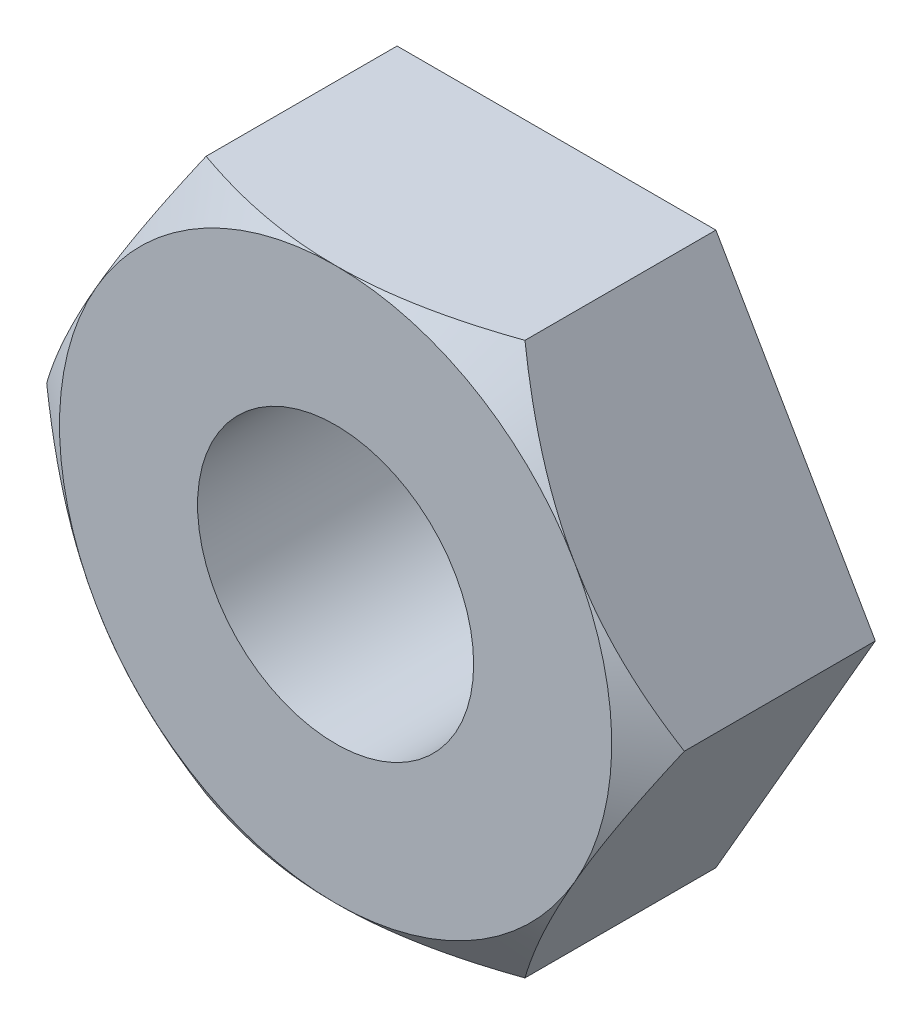
ISO-10303-21;
HEADER;
FILE_DESCRIPTION(('STEP AP214'),'2;1');
FILE_NAME('part.step','',(''),(''),'','','');
FILE_SCHEMA(('AUTOMOTIVE_DESIGN { 1 0 10303 214 1 1 1 1 }'));
ENDSEC;
DATA;
#1=APPLICATION_CONTEXT('core data for automotive mechanical design processes');
#2=APPLICATION_PROTOCOL_DEFINITION('international standard','automotive_design',2000,#1);
#3=PRODUCT_CONTEXT('',#1,'mechanical');
#4=PRODUCT('Part','Part','',(#3));
#5=PRODUCT_RELATED_PRODUCT_CATEGORY('part','',(#4));
#6=PRODUCT_DEFINITION_FORMATION('','',#4);
#7=PRODUCT_DEFINITION_CONTEXT('part definition',#1,'design');
#8=PRODUCT_DEFINITION('design','',#6,#7);
#9=PRODUCT_DEFINITION_SHAPE('','',#8);
#10=(LENGTH_UNIT() NAMED_UNIT(*) SI_UNIT(.MILLI.,.METRE.));
#11=(NAMED_UNIT(*) PLANE_ANGLE_UNIT() SI_UNIT($,.RADIAN.));
#12=(NAMED_UNIT(*) SI_UNIT($,.STERADIAN.) SOLID_ANGLE_UNIT());
#13=UNCERTAINTY_MEASURE_WITH_UNIT(LENGTH_MEASURE(1.E-05),#10,'distance_accuracy_value','');
#14=(GEOMETRIC_REPRESENTATION_CONTEXT(3) GLOBAL_UNCERTAINTY_ASSIGNED_CONTEXT((#13)) GLOBAL_UNIT_ASSIGNED_CONTEXT((#10,
#11,#12)) REPRESENTATION_CONTEXT('',''));
#15=CARTESIAN_POINT('',(0.,0.,0.));
#16=DIRECTION('',(0.,0.,1.));
#17=DIRECTION('',(1.,0.,0.));
#18=AXIS2_PLACEMENT_3D('',#15,#16,#17);
#19=CARTESIAN_POINT('',(1.15470053837925,2.,0.8));
#20=DIRECTION('',(0.,0.,1.));
#21=DIRECTION('',(1.,0.,0.));
#22=AXIS2_PLACEMENT_3D('',#19,#20,#21);
#23=PLANE('',#22);
#24=CARTESIAN_POINT('',(0.,0.,0.8));
#25=DIRECTION('',(0.,0.,1.));
#26=DIRECTION('',(1.,0.,0.));
#27=AXIS2_PLACEMENT_3D('',#24,#25,#26);
#28=CIRCLE('',#27,1.);
#29=CARTESIAN_POINT('',(1.,0.,0.8));
#30=VERTEX_POINT('',#29);
#31=EDGE_CURVE('E169',#30,#30,#28,.T.);
#32=ORIENTED_EDGE('',*,*,#31,.F.);
#33=EDGE_LOOP('',(#32));
#34=FACE_BOUND('',#33,.T.);
#35=CARTESIAN_POINT('',(0.,0.,0.799999999999999));
#36=DIRECTION('',(0.,0.,1.));
#37=DIRECTION('',(1.,0.,0.));
#38=AXIS2_PLACEMENT_3D('',#35,#36,#37);
#39=CIRCLE('',#38,2.);
#40=CARTESIAN_POINT('',(1.73205080756888,-1.,0.799999999999999));
#41=VERTEX_POINT('',#40);
#42=CARTESIAN_POINT('',(1.73205080756888,1.,0.8));
#43=VERTEX_POINT('',#42);
#44=EDGE_CURVE('E121',#41,#43,#39,.T.);
#45=ORIENTED_EDGE('',*,*,#44,.T.);
#46=CARTESIAN_POINT('',(0.,2.,0.799999999999999));
#47=VERTEX_POINT('',#46);
#48=EDGE_CURVE('E201',#43,#47,#39,.T.);
#49=ORIENTED_EDGE('',*,*,#48,.T.);
#50=CARTESIAN_POINT('',(-1.73205080756888,1.,0.799999999999999));
#51=VERTEX_POINT('',#50);
#52=EDGE_CURVE('E59',#47,#51,#39,.T.);
#53=ORIENTED_EDGE('',*,*,#52,.T.);
#54=CARTESIAN_POINT('',(-1.73205080756888,-1.,0.799999999999999));
#55=VERTEX_POINT('',#54);
#56=EDGE_CURVE('E67',#51,#55,#39,.T.);
#57=ORIENTED_EDGE('',*,*,#56,.T.);
#58=CARTESIAN_POINT('',(0.,-2.,0.799999999999999));
#59=VERTEX_POINT('',#58);
#60=EDGE_CURVE('E208',#55,#59,#39,.T.);
#61=ORIENTED_EDGE('',*,*,#60,.T.);
#62=EDGE_CURVE('E207',#59,#41,#39,.T.);
#63=ORIENTED_EDGE('',*,*,#62,.T.);
#64=EDGE_LOOP('',(#45,#49,#53,#57,#61,#63));
#65=FACE_BOUND('',#64,.T.);
#66=ADVANCED_FACE('F37',(#34,#65),#23,.T.);
#67=CARTESIAN_POINT('',(2.3094010767585,0.,0.8));
#68=DIRECTION('',(-0.866025403784439,-0.5,0.));
#69=DIRECTION('',(0.5,-0.866025403784439,0.));
#70=AXIS2_PLACEMENT_3D('',#67,#68,#69);
#71=PLANE('',#70);
#72=CARTESIAN_POINT('',(2.30951654681234,-0.00020000000000069,0.583274174657688));
#73=CARTESIAN_POINT('',(2.25778411813216,0.0894031948730001,0.619507263669363));
#74=CARTESIAN_POINT('',(2.20539528664442,0.180143312758932,0.652550247750761));
#75=CARTESIAN_POINT('',(2.09925963917471,0.363975646670687,0.710144070352881));
#76=CARTESIAN_POINT('',(2.04550834968942,0.457075611031562,0.734661524351928));
#77=CARTESIAN_POINT('',(1.93898677141294,0.641576396708848,0.772081133283967));
#78=CARTESIAN_POINT('',(1.88625233070749,0.732915127319412,0.785374731636175));
#79=CARTESIAN_POINT('',(1.78046357760028,0.91614662257046,0.800289318580044));
#80=CARTESIAN_POINT('',(1.72741013118885,1.0080378872717,0.801933933369361));
#81=CARTESIAN_POINT('',(1.63081324614062,1.17534860002811,0.794172660106361));
#82=CARTESIAN_POINT('',(1.58722846823554,1.25083964979632,0.786648102213638));
#83=CARTESIAN_POINT('',(1.50048455744658,1.40108451053002,0.764184819681816));
#84=CARTESIAN_POINT('',(1.45732611009091,1.47583713412583,0.749235673310628));
#85=CARTESIAN_POINT('',(1.37035664181109,1.62647267189372,0.712381428454249));
#86=CARTESIAN_POINT('',(1.32656782744707,1.70231712317541,0.690272229423728));
#87=CARTESIAN_POINT('',(1.23990987933956,1.85241309217728,0.640571886669888));
#88=CARTESIAN_POINT('',(1.19703839281209,1.92666868503887,0.612997283985985));
#89=CARTESIAN_POINT('',(1.15458506832541,2.0002,0.583274174657689));
#90=B_SPLINE_CURVE_WITH_KNOTS('',3,(#72,#73,#74,#75,#76,#77,#78,#79,#80,#81,#82,#83,#84,#85,#86,
#87,#88,#89),.UNSPECIFIED.,.F.,.F.,(4,2,2,2,2,2,2,2,4),(0.,0.32910803127541,0.659490652543948,
0.977809318633601,1.29548219285959,1.55762725777369,1.82014133438032,2.09091680676494,
2.36088495797509),.UNSPECIFIED.);
#91=CARTESIAN_POINT('',(2.3094010767585,0.,0.583355033723495));
#92=VERTEX_POINT('',#91);
#93=EDGE_CURVE('E118',#92,#43,#90,.T.);
#94=ORIENTED_EDGE('',*,*,#93,.F.);
#95=DIRECTION('',(0.,0.,-1.));
#96=VECTOR('',#95,1.);
#97=CARTESIAN_POINT('',(2.3094010767585,0.,0.8));
#98=LINE('',#97,#96);
#99=CARTESIAN_POINT('',(2.3094010767585,0.,-0.8));
#100=VERTEX_POINT('',#99);
#101=EDGE_CURVE('E129',#92,#100,#98,.T.);
#102=ORIENTED_EDGE('',*,*,#101,.T.);
#103=DIRECTION('',(-0.5,0.866025403784439,0.));
#104=VECTOR('',#103,1.);
#105=CARTESIAN_POINT('',(2.3094010767585,0.,-0.8));
#106=LINE('',#105,#104);
#107=CARTESIAN_POINT('',(1.15470053837925,2.,-0.8));
#108=VERTEX_POINT('',#107);
#109=EDGE_CURVE('E164',#100,#108,#106,.T.);
#110=ORIENTED_EDGE('',*,*,#109,.T.);
#111=DIRECTION('',(0.,0.,-1.));
#112=VECTOR('',#111,1.);
#113=CARTESIAN_POINT('',(1.15470053837925,2.,0.8));
#114=LINE('',#113,#112);
#115=CARTESIAN_POINT('',(1.15470053837925,2.,0.583355033723495));
#116=VERTEX_POINT('',#115);
#117=EDGE_CURVE('E126',#116,#108,#114,.T.);
#118=ORIENTED_EDGE('',*,*,#117,.F.);
#119=EDGE_CURVE('E132',#43,#116,#90,.T.);
#120=ORIENTED_EDGE('',*,*,#119,.F.);
#121=EDGE_LOOP('',(#94,#102,#110,#118,#120));
#122=FACE_BOUND('',#121,.T.);
#123=ADVANCED_FACE('F39',(#122),#71,.F.);
#124=CARTESIAN_POINT('',(1.15470053837925,2.,0.8));
#125=DIRECTION('',(0.,-1.,0.));
#126=DIRECTION('',(0.,0.,-1.));
#127=AXIS2_PLACEMENT_3D('',#124,#125,#126);
#128=PLANE('',#127);
#129=CARTESIAN_POINT('',(-2.8191766838577,2.,-0.219889241813767));
#130=CARTESIAN_POINT('',(-2.74297121513895,2.,-0.176380269391351));
#131=CARTESIAN_POINT('',(-2.66651760413476,2.,-0.133298500108083));
#132=CARTESIAN_POINT('',(-2.51299463672317,2.,-0.0482119639235155));
#133=CARTESIAN_POINT('',(-2.43592516340081,2.,-0.00620740821248471));
#134=CARTESIAN_POINT('',(-2.28058645857399,2.,0.0767488739029064));
#135=CARTESIAN_POINT('',(-2.20231270919896,2.,0.117692169957888));
#136=CARTESIAN_POINT('',(-2.0449224985674,2.,0.197920117900803));
#137=CARTESIAN_POINT('',(-1.96580608444907,2.,0.237204861963287));
#138=CARTESIAN_POINT('',(-1.80335382124232,2.,0.315249959708712));
#139=CARTESIAN_POINT('',(-1.71997670822833,2.,0.353924888974945));
#140=CARTESIAN_POINT('',(-1.55195645410267,2.,0.428414088914298));
#141=CARTESIAN_POINT('',(-1.46731345216578,2.,0.464228671355251));
#142=CARTESIAN_POINT('',(-1.29674707337203,2.,0.532121390800579));
#143=CARTESIAN_POINT('',(-1.21082698439502,2.,0.564207707255335));
#144=CARTESIAN_POINT('',(-1.037398107655,2.,0.623706131642043));
#145=CARTESIAN_POINT('',(-0.949889893904503,2.,0.651119892608389));
#146=CARTESIAN_POINT('',(-0.768173534643416,2.,0.701456523236103));
#147=CARTESIAN_POINT('',(-0.673867814524059,2.,0.724034327778477));
#148=CARTESIAN_POINT('',(-0.483653059748429,2.,0.761051042483176));
#149=CARTESIAN_POINT('',(-0.387744371850267,2.,0.775491690021057));
#150=CARTESIAN_POINT('',(-0.196551283886525,2.,0.79478481222121));
#151=CARTESIAN_POINT('',(-0.101283024865925,2.,0.799792740072569));
#152=CARTESIAN_POINT('',(0.0892798157634709,2.,0.800194649533309));
#153=CARTESIAN_POINT('',(0.184574398869968,2.,0.795587860594422));
#154=CARTESIAN_POINT('',(0.388196576547914,2.,0.775860001270581));
#155=CARTESIAN_POINT('',(0.496381585649626,2.,0.759293358145284));
#156=CARTESIAN_POINT('',(0.710713128216179,2.,0.715952925555117));
#157=CARTESIAN_POINT('',(0.816857948838925,2.,0.689170921963523));
#158=CARTESIAN_POINT('',(0.975539458827733,2.,0.64266257507892));
#159=CARTESIAN_POINT('',(1.02896763532891,2.,0.62586780869851));
#160=CARTESIAN_POINT('',(1.13519433067798,2.,0.590472884387112));
#161=CARTESIAN_POINT('',(1.18799315758703,2.,0.571873654212212));
#162=CARTESIAN_POINT('',(1.29301021359688,2.,0.533114671714075));
#163=CARTESIAN_POINT('',(1.34522845166966,2.,0.512954943544013));
#164=CARTESIAN_POINT('',(1.44913112259114,2.,0.471289645708212));
#165=CARTESIAN_POINT('',(1.50081548503897,2.,0.449783901120813));
#166=CARTESIAN_POINT('',(1.63801638124399,2.,0.390883613443955));
#167=CARTESIAN_POINT('',(1.72309272112933,2.,0.352463448707333));
#168=CARTESIAN_POINT('',(1.89207502383276,2.,0.273122074367048));
#169=CARTESIAN_POINT('',(1.97598082092938,2.,0.232200514950614));
#170=CARTESIAN_POINT('',(2.22629438294312,2.,0.106481936819523));
#171=CARTESIAN_POINT('',(2.39123084262083,2.,0.0187610511186462));
#172=CARTESIAN_POINT('',(2.71871689544958,2.,-0.161817441649822));
#173=CARTESIAN_POINT('',(2.88126016256911,2.,-0.254686344504105));
#174=CARTESIAN_POINT('',(3.20440100652004,2.,-0.443767283674238));
#175=CARTESIAN_POINT('',(3.36499843065985,2.,-0.5399795800862));
#176=CARTESIAN_POINT('',(3.66762714520601,2.,-0.724286640961938));
#177=CARTESIAN_POINT('',(3.80980273238063,2.,-0.812145607240306));
#178=CARTESIAN_POINT('',(4.09329630745319,2.,-0.989257497446967));
#179=CARTESIAN_POINT('',(4.23461423220025,2.,-1.07851052233336));
#180=CARTESIAN_POINT('',(4.51583404814013,2.,-1.25760000507412));
#181=CARTESIAN_POINT('',(4.65573947742155,2.,-1.34743091781437));
#182=CARTESIAN_POINT('',(4.93499948077018,2.,-1.52791192165095));
#183=CARTESIAN_POINT('',(5.07435411362233,2.,-1.61856192173827));
#184=CARTESIAN_POINT('',(5.21350663939195,2.,-1.70951845433762));
#185=B_SPLINE_CURVE_WITH_KNOTS('',3,(#129,#130,#131,#132,#133,#134,#135,#136,#137,#138,#139,
#140,#141,#142,#143,#144,#145,#146,#147,#148,#149,#150,#151,#152,#153,#154,#155,#156,#157,#158,
#159,#160,#161,#162,#163,#164,#165,#166,#167,#168,#169,#170,#171,#172,#173,#174,#175,#176,#177,
#178,#179,#180,#181,#182,#183,#184),.UNSPECIFIED.,.F.,.F.,(4,2,2,2,2,2,2,2,2,2,2,2,2,2,2,2,2,2,
2,2,2,2,2,2,2,2,2,4),(0.,0.263258223692854,0.5265676712106,0.791557617683941,1.05653281781902,
1.3322216142444,1.60788032042561,1.88292235926075,2.15786689215895,2.44848387732681,
2.73903878892932,3.02476191479573,3.31050794013164,3.63824370366175,3.96624355554821,
4.13423508305673,4.30214069172379,4.47004370209003,4.63796857779239,4.91795884213552,
5.19798835228419,5.75826869091611,6.31983120915388,6.88143751184348,7.38282430100352,
7.8842475706568,8.38303110171475,8.88175987809919),.UNSPECIFIED.);
#186=EDGE_CURVE('E160',#116,#47,#185,.F.);
#187=ORIENTED_EDGE('',*,*,#186,.F.);
#188=ORIENTED_EDGE('',*,*,#117,.T.);
#189=DIRECTION('',(-1.,0.,0.));
#190=VECTOR('',#189,1.);
#191=CARTESIAN_POINT('',(1.15470053837925,2.,-0.8));
#192=LINE('',#191,#190);
#193=CARTESIAN_POINT('',(-1.15470053837925,2.,-0.8));
#194=VERTEX_POINT('',#193);
#195=EDGE_CURVE('E157',#108,#194,#192,.T.);
#196=ORIENTED_EDGE('',*,*,#195,.T.);
#197=DIRECTION('',(0.,0.,-1.));
#198=VECTOR('',#197,1.);
#199=CARTESIAN_POINT('',(-1.15470053837925,2.,0.8));
#200=LINE('',#199,#198);
#201=CARTESIAN_POINT('',(-1.15470053837925,2.,0.583355033723495));
#202=VERTEX_POINT('',#201);
#203=EDGE_CURVE('E150',#202,#194,#200,.T.);
#204=ORIENTED_EDGE('',*,*,#203,.F.);
#205=EDGE_CURVE('E197',#47,#202,#185,.F.);
#206=ORIENTED_EDGE('',*,*,#205,.F.);
#207=EDGE_LOOP('',(#187,#188,#196,#204,#206));
#208=FACE_BOUND('',#207,.T.);
#209=ADVANCED_FACE('F155',(#208),#128,.F.);
#210=CARTESIAN_POINT('',(-1.15470053837925,2.,0.8));
#211=DIRECTION('',(0.866025403784438,-0.5,0.));
#212=DIRECTION('',(0.5,0.866025403784438,0.));
#213=AXIS2_PLACEMENT_3D('',#210,#211,#212);
#214=PLANE('',#213);
#215=CARTESIAN_POINT('',(-1.15458506832541,2.0002,0.583274174657689));
#216=CARTESIAN_POINT('',(-1.20631749700559,1.910596805127,0.619507263669364));
#217=CARTESIAN_POINT('',(-1.25870632849333,1.81985668724107,0.652550247750761));
#218=CARTESIAN_POINT('',(-1.36484197596304,1.63602435332931,0.710144070352881));
#219=CARTESIAN_POINT('',(-1.41859326544834,1.54292438896844,0.734661524351929));
#220=CARTESIAN_POINT('',(-1.52511484372482,1.35842360329115,0.772081133283967));
#221=CARTESIAN_POINT('',(-1.57784928443026,1.26708487268059,0.785374731636175));
#222=CARTESIAN_POINT('',(-1.68363803753747,1.08385337742954,0.800289318580044));
#223=CARTESIAN_POINT('',(-1.73669148394891,0.991962112728302,0.801933933369361));
#224=CARTESIAN_POINT('',(-1.83328836899713,0.82465139997189,0.794172660106361));
#225=CARTESIAN_POINT('',(-1.87687314690222,0.749160350203675,0.786648102213638));
#226=CARTESIAN_POINT('',(-1.96361705769117,0.598915489469984,0.764184819681816));
#227=CARTESIAN_POINT('',(-2.00677550504685,0.524162865874166,0.749235673310628));
#228=CARTESIAN_POINT('',(-2.09374497332666,0.373527328106279,0.712381428454248));
#229=CARTESIAN_POINT('',(-2.13753378769069,0.297682876824585,0.690272229423727));
#230=CARTESIAN_POINT('',(-2.22419173579819,0.147586907822717,0.640571886669888));
#231=CARTESIAN_POINT('',(-2.26706322232567,0.0733313149611262,0.612997283985984));
#232=CARTESIAN_POINT('',(-2.30951654681234,-0.000199999999999046,0.583274174657688));
#233=B_SPLINE_CURVE_WITH_KNOTS('',3,(#215,#216,#217,#218,#219,#220,#221,#222,#223,#224,#225,
#226,#227,#228,#229,#230,#231,#232),.UNSPECIFIED.,.F.,.F.,(4,2,2,2,2,2,2,2,4),(0.,
0.329108031275409,0.659490652543948,0.977809318633601,1.29548219285959,1.55762725777369,
1.82014133438032,2.09091680676494,2.36088495797509),.UNSPECIFIED.);
#234=EDGE_CURVE('E196',#202,#51,#233,.T.);
#235=ORIENTED_EDGE('',*,*,#234,.F.);
#236=ORIENTED_EDGE('',*,*,#203,.T.);
#237=DIRECTION('',(-0.5,-0.866025403784439,0.));
#238=VECTOR('',#237,1.);
#239=CARTESIAN_POINT('',(-1.15470053837925,2.,-0.8));
#240=LINE('',#239,#238);
#241=CARTESIAN_POINT('',(-2.3094010767585,0.,-0.8));
#242=VERTEX_POINT('',#241);
#243=EDGE_CURVE('E167',#194,#242,#240,.T.);
#244=ORIENTED_EDGE('',*,*,#243,.T.);
#245=DIRECTION('',(0.,0.,-1.));
#246=VECTOR('',#245,1.);
#247=CARTESIAN_POINT('',(-2.3094010767585,0.,0.8));
#248=LINE('',#247,#246);
#249=CARTESIAN_POINT('',(-2.3094010767585,0.,0.583355033723495));
#250=VERTEX_POINT('',#249);
#251=EDGE_CURVE('E148',#250,#242,#248,.T.);
#252=ORIENTED_EDGE('',*,*,#251,.F.);
#253=EDGE_CURVE('E215',#51,#250,#233,.T.);
#254=ORIENTED_EDGE('',*,*,#253,.F.);
#255=EDGE_LOOP('',(#235,#236,#244,#252,#254));
#256=FACE_BOUND('',#255,.T.);
#257=ADVANCED_FACE('F195',(#256),#214,.F.);
#258=CARTESIAN_POINT('',(-2.3094010767585,0.,0.8));
#259=DIRECTION('',(0.866025403784439,0.5,0.));
#260=DIRECTION('',(-0.5,0.866025403784439,0.));
#261=AXIS2_PLACEMENT_3D('',#258,#259,#260);
#262=PLANE('',#261);
#263=CARTESIAN_POINT('',(-2.30951654681234,0.000200000000000892,0.583274174657688));
#264=CARTESIAN_POINT('',(-2.25778411813216,-0.089403194873,0.619507263669363));
#265=CARTESIAN_POINT('',(-2.20539528664442,-0.180143312758931,0.652550247750761));
#266=CARTESIAN_POINT('',(-2.09925963917471,-0.363975646670686,0.71014407035288));
#267=CARTESIAN_POINT('',(-2.04550834968942,-0.457075611031562,0.734661524351928));
#268=CARTESIAN_POINT('',(-1.93898677141294,-0.641576396708848,0.772081133283967));
#269=CARTESIAN_POINT('',(-1.88625233070749,-0.732915127319412,0.785374731636175));
#270=CARTESIAN_POINT('',(-1.78046357760028,-0.91614662257046,0.800289318580044));
#271=CARTESIAN_POINT('',(-1.72741013118885,-1.0080378872717,0.801933933369362));
#272=CARTESIAN_POINT('',(-1.63081324614062,-1.17534860002811,0.794172660106361));
#273=CARTESIAN_POINT('',(-1.58722846823554,-1.25083964979632,0.786648102213638));
#274=CARTESIAN_POINT('',(-1.50048455744658,-1.40108451053002,0.764184819681817));
#275=CARTESIAN_POINT('',(-1.45732611009091,-1.47583713412583,0.749235673310628));
#276=CARTESIAN_POINT('',(-1.37035664181109,-1.62647267189372,0.712381428454249));
#277=CARTESIAN_POINT('',(-1.32656782744707,-1.70231712317541,0.690272229423728));
#278=CARTESIAN_POINT('',(-1.23990987933956,-1.85241309217728,0.640571886669889));
#279=CARTESIAN_POINT('',(-1.19703839281209,-1.92666868503887,0.612997283985985));
#280=CARTESIAN_POINT('',(-1.15458506832541,-2.0002,0.583274174657689));
#281=B_SPLINE_CURVE_WITH_KNOTS('',3,(#263,#264,#265,#266,#267,#268,#269,#270,#271,#272,#273,
#274,#275,#276,#277,#278,#279,#280),.UNSPECIFIED.,.F.,.F.,(4,2,2,2,2,2,2,2,4),(0.,
0.32910803127541,0.659490652543948,0.9778093186336,1.29548219285959,1.55762725777369,
1.82014133438032,2.09091680676494,2.36088495797509),.UNSPECIFIED.);
#282=EDGE_CURVE('E191',#250,#55,#281,.T.);
#283=ORIENTED_EDGE('',*,*,#282,.F.);
#284=ORIENTED_EDGE('',*,*,#251,.T.);
#285=DIRECTION('',(0.5,-0.866025403784439,0.));
#286=VECTOR('',#285,1.);
#287=CARTESIAN_POINT('',(-2.3094010767585,0.,-0.8));
#288=LINE('',#287,#286);
#289=CARTESIAN_POINT('',(-1.15470053837925,-2.,-0.8));
#290=VERTEX_POINT('',#289);
#291=EDGE_CURVE('E176',#242,#290,#288,.T.);
#292=ORIENTED_EDGE('',*,*,#291,.T.);
#293=DIRECTION('',(0.,0.,-1.));
#294=VECTOR('',#293,1.);
#295=CARTESIAN_POINT('',(-1.15470053837925,-2.,0.8));
#296=LINE('',#295,#294);
#297=CARTESIAN_POINT('',(-1.15470053837925,-2.,0.583355033723495));
#298=VERTEX_POINT('',#297);
#299=EDGE_CURVE('E141',#298,#290,#296,.T.);
#300=ORIENTED_EDGE('',*,*,#299,.F.);
#301=EDGE_CURVE('E213',#55,#298,#281,.T.);
#302=ORIENTED_EDGE('',*,*,#301,.F.);
#303=EDGE_LOOP('',(#283,#284,#292,#300,#302));
#304=FACE_BOUND('',#303,.T.);
#305=ADVANCED_FACE('F188',(#304),#262,.F.);
#306=CARTESIAN_POINT('',(-1.15470053837925,-2.,0.8));
#307=DIRECTION('',(0.,1.,0.));
#308=DIRECTION('',(-1.,0.,0.));
#309=AXIS2_PLACEMENT_3D('',#306,#307,#308);
#310=PLANE('',#309);
#311=CARTESIAN_POINT('',(-2.8191766838577,-2.,-0.219889241813767));
#312=CARTESIAN_POINT('',(-2.74297121513895,-2.,-0.176380269391351));
#313=CARTESIAN_POINT('',(-2.66651760413476,-2.,-0.133298500108083));
#314=CARTESIAN_POINT('',(-2.51299463672317,-2.,-0.0482119639235153));
#315=CARTESIAN_POINT('',(-2.43592516340081,-2.,-0.0062074082124846));
#316=CARTESIAN_POINT('',(-2.28058645857398,-2.,0.0767488739029065));
#317=CARTESIAN_POINT('',(-2.20231270919896,-2.,0.117692169957888));
#318=CARTESIAN_POINT('',(-2.0449224985674,-2.,0.197920117900803));
#319=CARTESIAN_POINT('',(-1.96580608444907,-2.,0.237204861963287));
#320=CARTESIAN_POINT('',(-1.80335382124232,-2.,0.315249959708712));
#321=CARTESIAN_POINT('',(-1.71997670822833,-2.,0.353924888974945));
#322=CARTESIAN_POINT('',(-1.55195645410267,-2.,0.428414088914299));
#323=CARTESIAN_POINT('',(-1.46731345216578,-2.,0.464228671355251));
#324=CARTESIAN_POINT('',(-1.29674707337203,-2.,0.532121390800579));
#325=CARTESIAN_POINT('',(-1.21082698439502,-2.,0.564207707255335));
#326=CARTESIAN_POINT('',(-1.037398107655,-2.,0.623706131642042));
#327=CARTESIAN_POINT('',(-0.949889893904503,-2.,0.651119892608389));
#328=CARTESIAN_POINT('',(-0.768173534643417,-2.,0.701456523236102));
#329=CARTESIAN_POINT('',(-0.673867814524059,-2.,0.724034327778476));
#330=CARTESIAN_POINT('',(-0.483653059748429,-2.,0.761051042483176));
#331=CARTESIAN_POINT('',(-0.387744371850267,-2.,0.775491690021056));
#332=CARTESIAN_POINT('',(-0.196551283886526,-2.,0.79478481222121));
#333=CARTESIAN_POINT('',(-0.101283024865925,-2.,0.799792740072569));
#334=CARTESIAN_POINT('',(0.0892798157634703,-2.,0.800194649533308));
#335=CARTESIAN_POINT('',(0.184574398869967,-2.,0.795587860594421));
#336=CARTESIAN_POINT('',(0.388196576547913,-2.,0.77586000127058));
#337=CARTESIAN_POINT('',(0.496381585649625,-2.,0.759293358145283));
#338=CARTESIAN_POINT('',(0.710713128216177,-2.,0.715952925555116));
#339=CARTESIAN_POINT('',(0.816857948838923,-2.,0.689170921963522));
#340=CARTESIAN_POINT('',(0.975539458827731,-2.,0.642662575078919));
#341=CARTESIAN_POINT('',(1.0289676353289,-2.,0.625867808698509));
#342=CARTESIAN_POINT('',(1.13519433067798,-2.,0.590472884387112));
#343=CARTESIAN_POINT('',(1.18799315758703,-2.,0.571873654212212));
#344=CARTESIAN_POINT('',(1.29301021359688,-2.,0.533114671714074));
#345=CARTESIAN_POINT('',(1.34522845166965,-2.,0.512954943544013));
#346=CARTESIAN_POINT('',(1.44913112259114,-2.,0.471289645708211));
#347=CARTESIAN_POINT('',(1.50081548503897,-2.,0.449783901120812));
#348=CARTESIAN_POINT('',(1.63801638124399,-2.,0.390883613443955));
#349=CARTESIAN_POINT('',(1.72309272112933,-2.,0.352463448707333));
#350=CARTESIAN_POINT('',(1.89207502383276,-2.,0.273122074367048));
#351=CARTESIAN_POINT('',(1.97598082092938,-2.,0.232200514950614));
#352=CARTESIAN_POINT('',(2.22629438294311,-2.,0.106481936819523));
#353=CARTESIAN_POINT('',(2.39123084262083,-2.,0.0187610511186462));
#354=CARTESIAN_POINT('',(2.71871689544958,-2.,-0.161817441649822));
#355=CARTESIAN_POINT('',(2.8812601625691,-2.,-0.254686344504105));
#356=CARTESIAN_POINT('',(3.20440100652004,-2.,-0.443767283674238));
#357=CARTESIAN_POINT('',(3.36499843065985,-2.,-0.539979580086199));
#358=CARTESIAN_POINT('',(3.66762714520601,-2.,-0.724286640961937));
#359=CARTESIAN_POINT('',(3.80980273238063,-2.,-0.812145607240306));
#360=CARTESIAN_POINT('',(4.09329630745319,-2.,-0.989257497446966));
#361=CARTESIAN_POINT('',(4.23461423220024,-2.,-1.07851052233336));
#362=CARTESIAN_POINT('',(4.51583404814013,-2.,-1.25760000507412));
#363=CARTESIAN_POINT('',(4.65573947742154,-2.,-1.34743091781437));
#364=CARTESIAN_POINT('',(4.93499948077018,-2.,-1.52791192165094));
#365=CARTESIAN_POINT('',(5.07435411362233,-2.,-1.61856192173826));
#366=CARTESIAN_POINT('',(5.21350663939195,-2.,-1.70951845433762));
#367=B_SPLINE_CURVE_WITH_KNOTS('',3,(#311,#312,#313,#314,#315,#316,#317,#318,#319,#320,#321,
#322,#323,#324,#325,#326,#327,#328,#329,#330,#331,#332,#333,#334,#335,#336,#337,#338,#339,#340,
#341,#342,#343,#344,#345,#346,#347,#348,#349,#350,#351,#352,#353,#354,#355,#356,#357,#358,#359,
#360,#361,#362,#363,#364,#365,#366),.UNSPECIFIED.,.F.,.F.,(4,2,2,2,2,2,2,2,2,2,2,2,2,2,2,2,2,2,
2,2,2,2,2,2,2,2,2,4),(0.,0.263258223692854,0.5265676712106,0.791557617683941,1.05653281781902,
1.3322216142444,1.60788032042561,1.88292235926075,2.15786689215895,2.44848387732681,
2.73903878892932,3.02476191479573,3.31050794013164,3.63824370366175,3.96624355554821,
4.13423508305672,4.30214069172379,4.47004370209002,4.63796857779239,4.91795884213551,
5.19798835228419,5.75826869091611,6.31983120915388,6.88143751184348,7.38282430100352,
7.8842475706568,8.38303110171475,8.88175987809919),.UNSPECIFIED.);
#368=EDGE_CURVE('E205',#298,#59,#367,.T.);
#369=ORIENTED_EDGE('',*,*,#368,.F.);
#370=ORIENTED_EDGE('',*,*,#299,.T.);
#371=DIRECTION('',(1.,0.,0.));
#372=VECTOR('',#371,1.);
#373=CARTESIAN_POINT('',(-1.15470053837925,-2.,-0.8));
#374=LINE('',#373,#372);
#375=CARTESIAN_POINT('',(1.15470053837925,-2.,-0.8));
#376=VERTEX_POINT('',#375);
#377=EDGE_CURVE('E143',#290,#376,#374,.T.);
#378=ORIENTED_EDGE('',*,*,#377,.T.);
#379=DIRECTION('',(0.,0.,-1.));
#380=VECTOR('',#379,1.);
#381=CARTESIAN_POINT('',(1.15470053837925,-2.,0.8));
#382=LINE('',#381,#380);
#383=CARTESIAN_POINT('',(1.15470053837925,-2.,0.583355033723495));
#384=VERTEX_POINT('',#383);
#385=EDGE_CURVE('E139',#384,#376,#382,.T.);
#386=ORIENTED_EDGE('',*,*,#385,.F.);
#387=EDGE_CURVE('E203',#59,#384,#367,.T.);
#388=ORIENTED_EDGE('',*,*,#387,.F.);
#389=EDGE_LOOP('',(#369,#370,#378,#386,#388));
#390=FACE_BOUND('',#389,.T.);
#391=ADVANCED_FACE('F183',(#390),#310,.F.);
#392=CARTESIAN_POINT('',(1.15470053837925,-2.,0.8));
#393=DIRECTION('',(-0.866025403784438,0.5,0.));
#394=DIRECTION('',(-0.5,-0.866025403784438,0.));
#395=AXIS2_PLACEMENT_3D('',#392,#393,#394);
#396=PLANE('',#395);
#397=CARTESIAN_POINT('',(1.15458506832541,-2.0002,0.583274174657688));
#398=CARTESIAN_POINT('',(1.20631749700559,-1.910596805127,0.619507263669363));
#399=CARTESIAN_POINT('',(1.25870632849333,-1.81985668724107,0.652550247750761));
#400=CARTESIAN_POINT('',(1.36484197596304,-1.63602435332931,0.710144070352881));
#401=CARTESIAN_POINT('',(1.41859326544834,-1.54292438896844,0.734661524351928));
#402=CARTESIAN_POINT('',(1.52511484372481,-1.35842360329115,0.772081133283967));
#403=CARTESIAN_POINT('',(1.57784928443026,-1.26708487268059,0.785374731636175));
#404=CARTESIAN_POINT('',(1.68363803753747,-1.08385337742954,0.800289318580044));
#405=CARTESIAN_POINT('',(1.73669148394891,-0.991962112728304,0.801933933369362));
#406=CARTESIAN_POINT('',(1.83328836899713,-0.824651399971891,0.794172660106361));
#407=CARTESIAN_POINT('',(1.87687314690222,-0.749160350203677,0.786648102213638));
#408=CARTESIAN_POINT('',(1.96361705769117,-0.598915489469985,0.764184819681816));
#409=CARTESIAN_POINT('',(2.00677550504685,-0.524162865874167,0.749235673310628));
#410=CARTESIAN_POINT('',(2.09374497332666,-0.373527328106279,0.712381428454249));
#411=CARTESIAN_POINT('',(2.13753378769069,-0.297682876824586,0.690272229423727));
#412=CARTESIAN_POINT('',(2.22419173579819,-0.147586907822717,0.640571886669888));
#413=CARTESIAN_POINT('',(2.26706322232567,-0.0733313149611267,0.612997283985985));
#414=CARTESIAN_POINT('',(2.30951654681234,0.000199999999999001,0.583274174657688));
#415=B_SPLINE_CURVE_WITH_KNOTS('',3,(#397,#398,#399,#400,#401,#402,#403,#404,#405,#406,#407,
#408,#409,#410,#411,#412,#413,#414),.UNSPECIFIED.,.F.,.F.,(4,2,2,2,2,2,2,2,4),(0.,
0.32910803127541,0.659490652543948,0.977809318633601,1.29548219285959,1.55762725777369,
1.82014133438032,2.09091680676494,2.36088495797509),.UNSPECIFIED.);
#416=EDGE_CURVE('E11',#384,#41,#415,.T.);
#417=ORIENTED_EDGE('',*,*,#416,.F.);
#418=ORIENTED_EDGE('',*,*,#385,.T.);
#419=DIRECTION('',(0.5,0.866025403784438,0.));
#420=VECTOR('',#419,1.);
#421=CARTESIAN_POINT('',(1.15470053837925,-2.,-0.8));
#422=LINE('',#421,#420);
#423=EDGE_CURVE('E137',#376,#100,#422,.T.);
#424=ORIENTED_EDGE('',*,*,#423,.T.);
#425=ORIENTED_EDGE('',*,*,#101,.F.);
#426=EDGE_CURVE('E42',#41,#92,#415,.T.);
#427=ORIENTED_EDGE('',*,*,#426,.F.);
#428=EDGE_LOOP('',(#417,#418,#424,#425,#427));
#429=FACE_BOUND('',#428,.T.);
#430=ADVANCED_FACE('F135',(#429),#396,.F.);
#431=CARTESIAN_POINT('',(1.15470053837925,2.,-0.8));
#432=DIRECTION('',(0.,0.,1.));
#433=DIRECTION('',(1.,0.,0.));
#434=AXIS2_PLACEMENT_3D('',#431,#432,#433);
#435=PLANE('',#434);
#436=ORIENTED_EDGE('',*,*,#109,.F.);
#437=ORIENTED_EDGE('',*,*,#423,.F.);
#438=ORIENTED_EDGE('',*,*,#377,.F.);
#439=ORIENTED_EDGE('',*,*,#291,.F.);
#440=ORIENTED_EDGE('',*,*,#243,.F.);
#441=ORIENTED_EDGE('',*,*,#195,.F.);
#442=EDGE_LOOP('',(#436,#437,#438,#439,#440,#441));
#443=FACE_BOUND('',#442,.T.);
#444=CARTESIAN_POINT('',(0.,0.,-0.8));
#445=DIRECTION('',(0.,0.,1.));
#446=DIRECTION('',(1.,0.,0.));
#447=AXIS2_PLACEMENT_3D('',#444,#445,#446);
#448=CIRCLE('',#447,1.);
#449=CARTESIAN_POINT('',(1.,0.,-0.8));
#450=VERTEX_POINT('',#449);
#451=EDGE_CURVE('E133',#450,#450,#448,.T.);
#452=ORIENTED_EDGE('',*,*,#451,.T.);
#453=EDGE_LOOP('',(#452));
#454=FACE_BOUND('',#453,.T.);
#455=ADVANCED_FACE('F162',(#443,#454),#435,.F.);
#456=CARTESIAN_POINT('',(0.,0.,0.8));
#457=DIRECTION('',(0.,0.,-1.));
#458=DIRECTION('',(-1.,0.,0.));
#459=AXIS2_PLACEMENT_3D('',#456,#457,#458);
#460=CYLINDRICAL_SURFACE('',#459,1.);
#461=ORIENTED_EDGE('',*,*,#31,.T.);
#462=EDGE_LOOP('',(#461));
#463=FACE_BOUND('',#462,.T.);
#464=ORIENTED_EDGE('',*,*,#451,.F.);
#465=EDGE_LOOP('',(#464));
#466=FACE_BOUND('',#465,.T.);
#467=ADVANCED_FACE('F238',(#463,#466),#460,.F.);
#468=CARTESIAN_POINT('',(0.,0.,0.799999999999999));
#469=DIRECTION('',(0.,0.,-1.));
#470=DIRECTION('',(1.,0.,0.));
#471=AXIS2_PLACEMENT_3D('',#468,#469,#470);
#472=CONICAL_SURFACE('',#471,2.,0.959931088596883);
#473=ORIENTED_EDGE('',*,*,#93,.T.);
#474=ORIENTED_EDGE('',*,*,#44,.F.);
#475=ORIENTED_EDGE('',*,*,#426,.T.);
#476=EDGE_LOOP('',(#473,#474,#475));
#477=FACE_BOUND('',#476,.T.);
#478=ADVANCED_FACE('F117',(#477),#472,.T.);
#479=ORIENTED_EDGE('',*,*,#387,.T.);
#480=ORIENTED_EDGE('',*,*,#416,.T.);
#481=ORIENTED_EDGE('',*,*,#62,.F.);
#482=EDGE_LOOP('',(#479,#480,#481));
#483=FACE_BOUND('',#482,.T.);
#484=ADVANCED_FACE('F237',(#483),#472,.T.);
#485=ORIENTED_EDGE('',*,*,#301,.T.);
#486=ORIENTED_EDGE('',*,*,#368,.T.);
#487=ORIENTED_EDGE('',*,*,#60,.F.);
#488=EDGE_LOOP('',(#485,#486,#487));
#489=FACE_BOUND('',#488,.T.);
#490=ADVANCED_FACE('F212',(#489),#472,.T.);
#491=ORIENTED_EDGE('',*,*,#253,.T.);
#492=ORIENTED_EDGE('',*,*,#282,.T.);
#493=ORIENTED_EDGE('',*,*,#56,.F.);
#494=EDGE_LOOP('',(#491,#492,#493));
#495=FACE_BOUND('',#494,.T.);
#496=ADVANCED_FACE('F214',(#495),#472,.T.);
#497=ORIENTED_EDGE('',*,*,#205,.T.);
#498=ORIENTED_EDGE('',*,*,#234,.T.);
#499=ORIENTED_EDGE('',*,*,#52,.F.);
#500=EDGE_LOOP('',(#497,#498,#499));
#501=FACE_BOUND('',#500,.T.);
#502=ADVANCED_FACE('F312',(#501),#472,.T.);
#503=ORIENTED_EDGE('',*,*,#119,.T.);
#504=ORIENTED_EDGE('',*,*,#186,.T.);
#505=ORIENTED_EDGE('',*,*,#48,.F.);
#506=EDGE_LOOP('',(#503,#504,#505));
#507=FACE_BOUND('',#506,.T.);
#508=ADVANCED_FACE('F239',(#507),#472,.T.);
#509=CLOSED_SHELL('',(#66,#123,#209,#257,#305,#391,#430,#455,#467,#478,#484,#490,#496,#502,#508));
#510=MANIFOLD_SOLID_BREP('B2',#509);
#511=ADVANCED_BREP_SHAPE_REPRESENTATION('',(#18,#510),#14);
#512=SHAPE_DEFINITION_REPRESENTATION(#9,#511);
ENDSEC;
END-ISO-10303-21;
